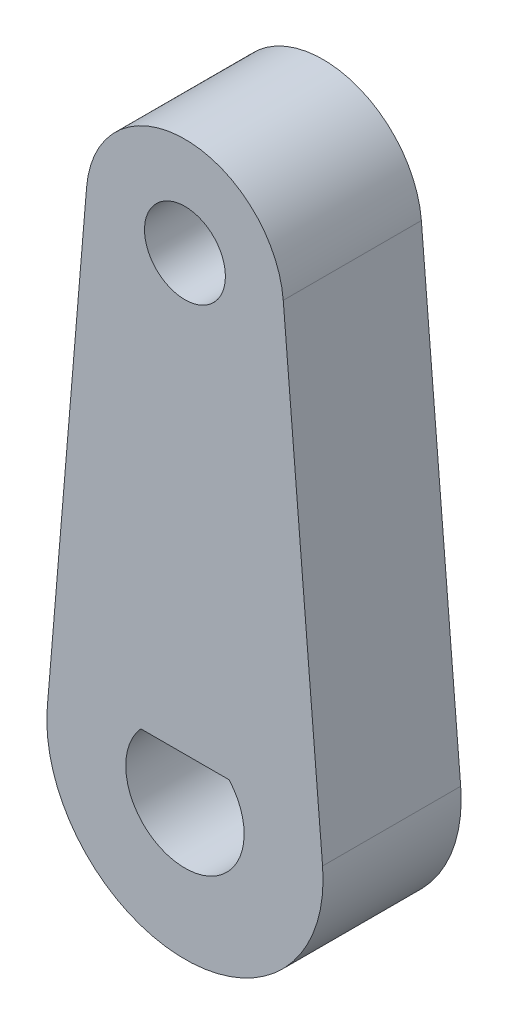
ISO-10303-21;
HEADER;
FILE_DESCRIPTION(('STEP AP214'),'2;1');
FILE_NAME('part.step','',(''),(''),'','','');
FILE_SCHEMA(('AUTOMOTIVE_DESIGN { 1 0 10303 214 1 1 1 1 }'));
ENDSEC;
DATA;
#1=APPLICATION_CONTEXT('core data for automotive mechanical design processes');
#2=APPLICATION_PROTOCOL_DEFINITION('international standard','automotive_design',2000,#1);
#3=PRODUCT_CONTEXT('',#1,'mechanical');
#4=PRODUCT('Part','Part','',(#3));
#5=PRODUCT_RELATED_PRODUCT_CATEGORY('part','',(#4));
#6=PRODUCT_DEFINITION_FORMATION('','',#4);
#7=PRODUCT_DEFINITION_CONTEXT('part definition',#1,'design');
#8=PRODUCT_DEFINITION('design','',#6,#7);
#9=PRODUCT_DEFINITION_SHAPE('','',#8);
#10=(LENGTH_UNIT() NAMED_UNIT(*) SI_UNIT(.MILLI.,.METRE.));
#11=(NAMED_UNIT(*) PLANE_ANGLE_UNIT() SI_UNIT($,.RADIAN.));
#12=(NAMED_UNIT(*) SI_UNIT($,.STERADIAN.) SOLID_ANGLE_UNIT());
#13=UNCERTAINTY_MEASURE_WITH_UNIT(LENGTH_MEASURE(1.E-05),#10,'distance_accuracy_value','');
#14=(GEOMETRIC_REPRESENTATION_CONTEXT(3) GLOBAL_UNCERTAINTY_ASSIGNED_CONTEXT((#13)) GLOBAL_UNIT_ASSIGNED_CONTEXT((#10,
#11,#12)) REPRESENTATION_CONTEXT('',''));
#15=CARTESIAN_POINT('',(0.,0.,0.));
#16=DIRECTION('',(0.,0.,1.));
#17=DIRECTION('',(1.,0.,0.));
#18=AXIS2_PLACEMENT_3D('',#15,#16,#17);
#19=CARTESIAN_POINT('',(0.,12.,3.5));
#20=DIRECTION('',(0.,0.,-1.));
#21=DIRECTION('',(-1.,0.,0.));
#22=AXIS2_PLACEMENT_3D('',#19,#20,#21);
#23=CYLINDRICAL_SURFACE('',#22,2.5);
#24=CARTESIAN_POINT('',(0.,12.,0.));
#25=DIRECTION('',(0.,0.,1.));
#26=DIRECTION('',(1.,0.,0.));
#27=AXIS2_PLACEMENT_3D('',#24,#25,#26);
#28=CIRCLE('',#27,2.5);
#29=CARTESIAN_POINT('',(2.49130432147946,12.2083333333333,0.));
#30=VERTEX_POINT('',#29);
#31=CARTESIAN_POINT('',(-2.49130432147946,12.2083333333333,0.));
#32=VERTEX_POINT('',#31);
#33=EDGE_CURVE('E125',#30,#32,#28,.T.);
#34=ORIENTED_EDGE('',*,*,#33,.T.);
#35=DIRECTION('',(0.,0.,-1.));
#36=VECTOR('',#35,1.);
#37=CARTESIAN_POINT('',(-2.49130432147946,12.2083333333333,3.5));
#38=LINE('',#37,#36);
#39=CARTESIAN_POINT('',(-2.49130432147946,12.2083333333333,3.5));
#40=VERTEX_POINT('',#39);
#41=EDGE_CURVE('E11',#40,#32,#38,.T.);
#42=ORIENTED_EDGE('',*,*,#41,.F.);
#43=CARTESIAN_POINT('',(0.,12.,3.5));
#44=DIRECTION('',(0.,0.,1.));
#45=DIRECTION('',(1.,0.,0.));
#46=AXIS2_PLACEMENT_3D('',#43,#44,#45);
#47=CIRCLE('',#46,2.5);
#48=CARTESIAN_POINT('',(2.49130432147946,12.2083333333333,3.5));
#49=VERTEX_POINT('',#48);
#50=EDGE_CURVE('E111',#49,#40,#47,.T.);
#51=ORIENTED_EDGE('',*,*,#50,.F.);
#52=DIRECTION('',(0.,0.,-1.));
#53=VECTOR('',#52,1.);
#54=CARTESIAN_POINT('',(2.49130432147946,12.2083333333333,3.5));
#55=LINE('',#54,#53);
#56=EDGE_CURVE('E122',#49,#30,#55,.T.);
#57=ORIENTED_EDGE('',*,*,#56,.T.);
#58=EDGE_LOOP('',(#34,#42,#51,#57));
#59=FACE_BOUND('',#58,.T.);
#60=ADVANCED_FACE('F39',(#59),#23,.T.);
#61=CARTESIAN_POINT('',(-2.49130432147946,12.2083333333333,3.5));
#62=DIRECTION('',(0.996521728591783,-0.0833333333333331,0.));
#63=DIRECTION('',(0.0833333333333331,0.996521728591783,0.));
#64=AXIS2_PLACEMENT_3D('',#61,#62,#63);
#65=PLANE('',#64);
#66=DIRECTION('',(-0.0833333333333331,-0.996521728591783,0.));
#67=VECTOR('',#66,1.);
#68=CARTESIAN_POINT('',(-2.49130432147946,12.2083333333333,0.));
#69=LINE('',#68,#67);
#70=CARTESIAN_POINT('',(-3.48782605007124,0.291666666666667,0.));
#71=VERTEX_POINT('',#70);
#72=EDGE_CURVE('E123',#32,#71,#69,.T.);
#73=ORIENTED_EDGE('',*,*,#72,.T.);
#74=DIRECTION('',(0.,0.,-1.));
#75=VECTOR('',#74,1.);
#76=CARTESIAN_POINT('',(-3.48782605007124,0.291666666666667,3.5));
#77=LINE('',#76,#75);
#78=CARTESIAN_POINT('',(-3.48782605007124,0.291666666666667,3.5));
#79=VERTEX_POINT('',#78);
#80=EDGE_CURVE('E46',#79,#71,#77,.T.);
#81=ORIENTED_EDGE('',*,*,#80,.F.);
#82=DIRECTION('',(-0.0833333333333331,-0.996521728591783,0.));
#83=VECTOR('',#82,1.);
#84=CARTESIAN_POINT('',(-2.49130432147946,12.2083333333333,3.5));
#85=LINE('',#84,#83);
#86=EDGE_CURVE('E112',#40,#79,#85,.T.);
#87=ORIENTED_EDGE('',*,*,#86,.F.);
#88=ORIENTED_EDGE('',*,*,#41,.T.);
#89=EDGE_LOOP('',(#73,#81,#87,#88));
#90=FACE_BOUND('',#89,.T.);
#91=ADVANCED_FACE('F152',(#90),#65,.F.);
#92=CARTESIAN_POINT('',(0.,0.,3.5));
#93=DIRECTION('',(0.,0.,-1.));
#94=DIRECTION('',(-1.,0.,0.));
#95=AXIS2_PLACEMENT_3D('',#92,#93,#94);
#96=CYLINDRICAL_SURFACE('',#95,3.5);
#97=CARTESIAN_POINT('',(0.,0.,0.));
#98=DIRECTION('',(0.,0.,1.));
#99=DIRECTION('',(1.,0.,0.));
#100=AXIS2_PLACEMENT_3D('',#97,#98,#99);
#101=CIRCLE('',#100,3.5);
#102=CARTESIAN_POINT('',(3.48782605007124,0.291666666666666,0.));
#103=VERTEX_POINT('',#102);
#104=EDGE_CURVE('E126',#71,#103,#101,.T.);
#105=ORIENTED_EDGE('',*,*,#104,.T.);
#106=DIRECTION('',(0.,0.,-1.));
#107=VECTOR('',#106,1.);
#108=CARTESIAN_POINT('',(3.48782605007124,0.291666666666666,3.5));
#109=LINE('',#108,#107);
#110=CARTESIAN_POINT('',(3.48782605007124,0.291666666666666,3.5));
#111=VERTEX_POINT('',#110);
#112=EDGE_CURVE('E134',#111,#103,#109,.T.);
#113=ORIENTED_EDGE('',*,*,#112,.F.);
#114=CARTESIAN_POINT('',(0.,0.,3.5));
#115=DIRECTION('',(0.,0.,1.));
#116=DIRECTION('',(1.,0.,0.));
#117=AXIS2_PLACEMENT_3D('',#114,#115,#116);
#118=CIRCLE('',#117,3.5);
#119=EDGE_CURVE('E120',#79,#111,#118,.T.);
#120=ORIENTED_EDGE('',*,*,#119,.F.);
#121=ORIENTED_EDGE('',*,*,#80,.T.);
#122=EDGE_LOOP('',(#105,#113,#120,#121));
#123=FACE_BOUND('',#122,.T.);
#124=ADVANCED_FACE('F139',(#123),#96,.T.);
#125=CARTESIAN_POINT('',(2.49130432147946,12.2083333333333,3.5));
#126=DIRECTION('',(-0.996521728591783,-0.0833333333333332,0.));
#127=DIRECTION('',(0.0833333333333332,-0.996521728591783,0.));
#128=AXIS2_PLACEMENT_3D('',#125,#126,#127);
#129=PLANE('',#128);
#130=DIRECTION('',(-0.0833333333333332,0.996521728591783,0.));
#131=VECTOR('',#130,1.);
#132=CARTESIAN_POINT('',(2.49130432147946,12.2083333333333,0.));
#133=LINE('',#132,#131);
#134=EDGE_CURVE('E114',#103,#30,#133,.T.);
#135=ORIENTED_EDGE('',*,*,#134,.T.);
#136=ORIENTED_EDGE('',*,*,#56,.F.);
#137=DIRECTION('',(-0.0833333333333332,0.996521728591783,0.));
#138=VECTOR('',#137,1.);
#139=CARTESIAN_POINT('',(2.49130432147946,12.2083333333333,3.5));
#140=LINE('',#139,#138);
#141=EDGE_CURVE('E118',#111,#49,#140,.T.);
#142=ORIENTED_EDGE('',*,*,#141,.F.);
#143=ORIENTED_EDGE('',*,*,#112,.T.);
#144=EDGE_LOOP('',(#135,#136,#142,#143));
#145=FACE_BOUND('',#144,.T.);
#146=ADVANCED_FACE('F150',(#145),#129,.F.);
#147=CARTESIAN_POINT('',(0.,12.,3.5));
#148=DIRECTION('',(0.,0.,1.));
#149=DIRECTION('',(1.,0.,0.));
#150=AXIS2_PLACEMENT_3D('',#147,#148,#149);
#151=PLANE('',#150);
#152=CARTESIAN_POINT('',(0.,12.,3.5));
#153=DIRECTION('',(0.,0.,1.));
#154=DIRECTION('',(1.,0.,0.));
#155=AXIS2_PLACEMENT_3D('',#152,#153,#154);
#156=CIRCLE('',#155,1.025);
#157=CARTESIAN_POINT('',(1.025,12.,3.5));
#158=VERTEX_POINT('',#157);
#159=EDGE_CURVE('E105',#158,#158,#156,.T.);
#160=ORIENTED_EDGE('',*,*,#159,.F.);
#161=EDGE_LOOP('',(#160));
#162=FACE_BOUND('',#161,.T.);
#163=CARTESIAN_POINT('',(0.,0.,3.5));
#164=DIRECTION('',(0.,0.,1.));
#165=DIRECTION('',(1.,0.,0.));
#166=AXIS2_PLACEMENT_3D('',#163,#164,#165);
#167=CIRCLE('',#166,1.5);
#168=CARTESIAN_POINT('',(-1.1180339887499,1.,3.5));
#169=VERTEX_POINT('',#168);
#170=CARTESIAN_POINT('',(1.1180339887499,0.999999999999999,3.5));
#171=VERTEX_POINT('',#170);
#172=EDGE_CURVE('E52',#169,#171,#167,.T.);
#173=ORIENTED_EDGE('',*,*,#172,.F.);
#174=DIRECTION('',(-1.,0.,0.));
#175=VECTOR('',#174,1.);
#176=CARTESIAN_POINT('',(-1.1180339887499,1.,3.5));
#177=LINE('',#176,#175);
#178=EDGE_CURVE('E98',#171,#169,#177,.T.);
#179=ORIENTED_EDGE('',*,*,#178,.F.);
#180=EDGE_LOOP('',(#173,#179));
#181=FACE_BOUND('',#180,.T.);
#182=ORIENTED_EDGE('',*,*,#50,.T.);
#183=ORIENTED_EDGE('',*,*,#86,.T.);
#184=ORIENTED_EDGE('',*,*,#119,.T.);
#185=ORIENTED_EDGE('',*,*,#141,.T.);
#186=EDGE_LOOP('',(#182,#183,#184,#185));
#187=FACE_BOUND('',#186,.T.);
#188=ADVANCED_FACE('F99',(#162,#181,#187),#151,.T.);
#189=CARTESIAN_POINT('',(0.,12.,0.));
#190=DIRECTION('',(0.,0.,1.));
#191=DIRECTION('',(1.,0.,0.));
#192=AXIS2_PLACEMENT_3D('',#189,#190,#191);
#193=PLANE('',#192);
#194=CARTESIAN_POINT('',(0.,12.,0.));
#195=DIRECTION('',(0.,0.,1.));
#196=DIRECTION('',(1.,0.,0.));
#197=AXIS2_PLACEMENT_3D('',#194,#195,#196);
#198=CIRCLE('',#197,1.025);
#199=CARTESIAN_POINT('',(1.025,12.,0.));
#200=VERTEX_POINT('',#199);
#201=EDGE_CURVE('E102',#200,#200,#198,.T.);
#202=ORIENTED_EDGE('',*,*,#201,.T.);
#203=EDGE_LOOP('',(#202));
#204=FACE_BOUND('',#203,.T.);
#205=DIRECTION('',(-1.,0.,0.));
#206=VECTOR('',#205,1.);
#207=CARTESIAN_POINT('',(-1.1180339887499,1.,0.));
#208=LINE('',#207,#206);
#209=CARTESIAN_POINT('',(1.1180339887499,1.,0.));
#210=VERTEX_POINT('',#209);
#211=CARTESIAN_POINT('',(-1.1180339887499,0.999999999999999,0.));
#212=VERTEX_POINT('',#211);
#213=EDGE_CURVE('E108',#210,#212,#208,.T.);
#214=ORIENTED_EDGE('',*,*,#213,.T.);
#215=CARTESIAN_POINT('',(0.,0.,0.));
#216=DIRECTION('',(0.,0.,1.));
#217=DIRECTION('',(1.,0.,0.));
#218=AXIS2_PLACEMENT_3D('',#215,#216,#217);
#219=CIRCLE('',#218,1.5);
#220=EDGE_CURVE('E59',#212,#210,#219,.T.);
#221=ORIENTED_EDGE('',*,*,#220,.T.);
#222=EDGE_LOOP('',(#214,#221));
#223=FACE_BOUND('',#222,.T.);
#224=ORIENTED_EDGE('',*,*,#33,.F.);
#225=ORIENTED_EDGE('',*,*,#134,.F.);
#226=ORIENTED_EDGE('',*,*,#104,.F.);
#227=ORIENTED_EDGE('',*,*,#72,.F.);
#228=EDGE_LOOP('',(#224,#225,#226,#227));
#229=FACE_BOUND('',#228,.T.);
#230=ADVANCED_FACE('F143',(#204,#223,#229),#193,.F.);
#231=CARTESIAN_POINT('',(0.,0.,0.));
#232=DIRECTION('',(0.,0.,1.));
#233=DIRECTION('',(1.,0.,0.));
#234=AXIS2_PLACEMENT_3D('',#231,#232,#233);
#235=CYLINDRICAL_SURFACE('',#234,1.5);
#236=ORIENTED_EDGE('',*,*,#172,.T.);
#237=DIRECTION('',(0.,0.,1.));
#238=VECTOR('',#237,1.);
#239=CARTESIAN_POINT('',(1.1180339887499,1.,0.));
#240=LINE('',#239,#238);
#241=EDGE_CURVE('E93',#210,#171,#240,.T.);
#242=ORIENTED_EDGE('',*,*,#241,.F.);
#243=ORIENTED_EDGE('',*,*,#220,.F.);
#244=DIRECTION('',(0.,0.,1.));
#245=VECTOR('',#244,1.);
#246=CARTESIAN_POINT('',(-1.1180339887499,1.,0.));
#247=LINE('',#246,#245);
#248=EDGE_CURVE('E89',#212,#169,#247,.T.);
#249=ORIENTED_EDGE('',*,*,#248,.T.);
#250=EDGE_LOOP('',(#236,#242,#243,#249));
#251=FACE_BOUND('',#250,.T.);
#252=ADVANCED_FACE('F90',(#251),#235,.F.);
#253=CARTESIAN_POINT('',(-1.1180339887499,1.,0.));
#254=DIRECTION('',(0.,1.,0.));
#255=DIRECTION('',(0.,0.,1.));
#256=AXIS2_PLACEMENT_3D('',#253,#254,#255);
#257=PLANE('',#256);
#258=ORIENTED_EDGE('',*,*,#178,.T.);
#259=ORIENTED_EDGE('',*,*,#248,.F.);
#260=ORIENTED_EDGE('',*,*,#213,.F.);
#261=ORIENTED_EDGE('',*,*,#241,.T.);
#262=EDGE_LOOP('',(#258,#259,#260,#261));
#263=FACE_BOUND('',#262,.T.);
#264=ADVANCED_FACE('F97',(#263),#257,.F.);
#265=CARTESIAN_POINT('',(0.,12.,0.));
#266=DIRECTION('',(0.,0.,1.));
#267=DIRECTION('',(1.,0.,0.));
#268=AXIS2_PLACEMENT_3D('',#265,#266,#267);
#269=CYLINDRICAL_SURFACE('',#268,1.025);
#270=ORIENTED_EDGE('',*,*,#201,.F.);
#271=EDGE_LOOP('',(#270));
#272=FACE_BOUND('',#271,.T.);
#273=ORIENTED_EDGE('',*,*,#159,.T.);
#274=EDGE_LOOP('',(#273));
#275=FACE_BOUND('',#274,.T.);
#276=ADVANCED_FACE('F171',(#272,#275),#269,.F.);
#277=CLOSED_SHELL('',(#60,#91,#124,#146,#188,#230,#252,#264,#276));
#278=MANIFOLD_SOLID_BREP('B2',#277);
#279=ADVANCED_BREP_SHAPE_REPRESENTATION('',(#18,#278),#14);
#280=SHAPE_DEFINITION_REPRESENTATION(#9,#279);
ENDSEC;
END-ISO-10303-21;
